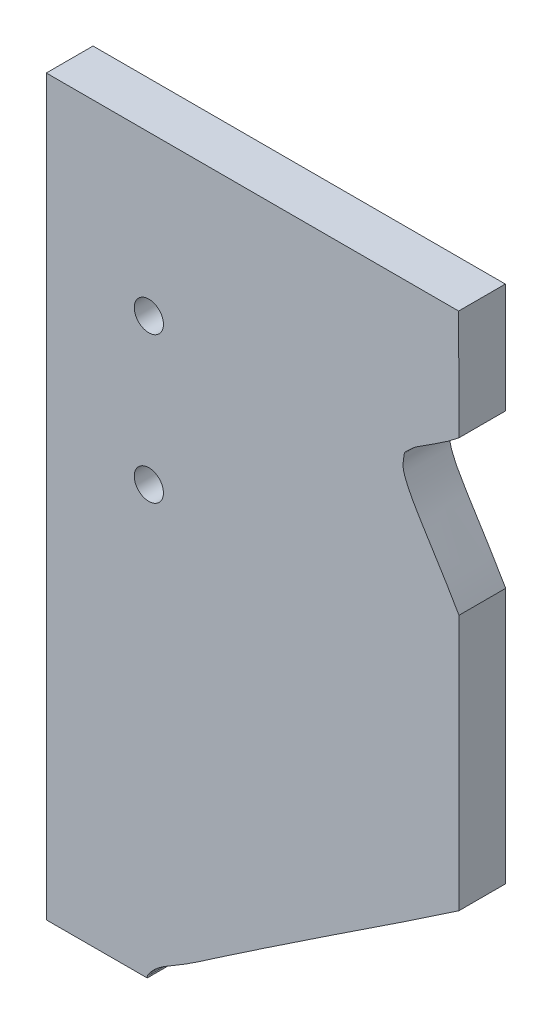
ISO-10303-21;
HEADER;
FILE_DESCRIPTION(('STEP AP214'),'2;1');
FILE_NAME('part.step','',(''),(''),'','','');
FILE_SCHEMA(('AUTOMOTIVE_DESIGN { 1 0 10303 214 1 1 1 1 }'));
ENDSEC;
DATA;
#1=APPLICATION_CONTEXT('core data for automotive mechanical design processes');
#2=APPLICATION_PROTOCOL_DEFINITION('international standard','automotive_design',2000,#1);
#3=PRODUCT_CONTEXT('',#1,'mechanical');
#4=PRODUCT('Part','Part','',(#3));
#5=PRODUCT_RELATED_PRODUCT_CATEGORY('part','',(#4));
#6=PRODUCT_DEFINITION_FORMATION('','',#4);
#7=PRODUCT_DEFINITION_CONTEXT('part definition',#1,'design');
#8=PRODUCT_DEFINITION('design','',#6,#7);
#9=PRODUCT_DEFINITION_SHAPE('','',#8);
#10=(LENGTH_UNIT() NAMED_UNIT(*) SI_UNIT(.MILLI.,.METRE.));
#11=(NAMED_UNIT(*) PLANE_ANGLE_UNIT() SI_UNIT($,.RADIAN.));
#12=(NAMED_UNIT(*) SI_UNIT($,.STERADIAN.) SOLID_ANGLE_UNIT());
#13=UNCERTAINTY_MEASURE_WITH_UNIT(LENGTH_MEASURE(1.E-05),#10,'distance_accuracy_value','');
#14=(GEOMETRIC_REPRESENTATION_CONTEXT(3) GLOBAL_UNCERTAINTY_ASSIGNED_CONTEXT((#13)) GLOBAL_UNIT_ASSIGNED_CONTEXT((#10,
#11,#12)) REPRESENTATION_CONTEXT('',''));
#15=CARTESIAN_POINT('',(0.,0.,0.));
#16=DIRECTION('',(0.,0.,1.));
#17=DIRECTION('',(1.,0.,0.));
#18=AXIS2_PLACEMENT_3D('',#15,#16,#17);
#19=CARTESIAN_POINT('',(-55.4502078162513,-28.5161604720001,59.9999999999997));
#20=DIRECTION('',(0.,0.,-1.));
#21=DIRECTION('',(-1.,0.,0.));
#22=AXIS2_PLACEMENT_3D('',#19,#20,#21);
#23=PLANE('',#22);
#24=CARTESIAN_POINT('',(-100.,-50.,59.9999999999997));
#25=DIRECTION('',(0.,0.,-1.));
#26=DIRECTION('',(-1.,0.,0.));
#27=AXIS2_PLACEMENT_3D('',#24,#25,#26);
#28=CIRCLE('',#27,2.5);
#29=CARTESIAN_POINT('',(-102.5,-50.,59.9999999999997));
#30=VERTEX_POINT('',#29);
#31=EDGE_CURVE('E193',#30,#30,#28,.F.);
#32=ORIENTED_EDGE('',*,*,#31,.T.);
#33=EDGE_LOOP('',(#32));
#34=FACE_BOUND('',#33,.T.);
#35=DIRECTION('',(-0.00329523929890578,0.999994570684243,0.));
#36=VECTOR('',#35,1.);
#37=CARTESIAN_POINT('',(-46.9522397554417,2.25600000000002,59.9999999999997));
#38=LINE('',#37,#36);
#39=CARTESIAN_POINT('',(-46.8903743110803,-16.5180867544561,59.9999999999997));
#40=VERTEX_POINT('',#39);
#41=CARTESIAN_POINT('',(-46.9522397554417,2.25600000000002,59.9999999999997));
#42=VERTEX_POINT('',#41);
#43=EDGE_CURVE('E208',#40,#42,#38,.T.);
#44=ORIENTED_EDGE('',*,*,#43,.F.);
#45=CARTESIAN_POINT('',(-46.8903743110803,-42.8368554623857,59.9999999999997));
#46=CARTESIAN_POINT('',(-47.577841512641,-41.627083206683,59.9999999999997));
#47=CARTESIAN_POINT('',(-48.2843458582711,-40.4287165550813,59.9999999999997));
#48=CARTESIAN_POINT('',(-49.7245958218818,-38.0483041436303,59.9999999999997));
#49=CARTESIAN_POINT('',(-50.4581048826457,-36.8661166567474,59.9999999999997));
#50=CARTESIAN_POINT('',(-51.9331435844763,-34.5065470026901,59.9999999999997));
#51=CARTESIAN_POINT('',(-52.6767856865731,-33.3300541308021,59.9999999999997));
#52=CARTESIAN_POINT('',(-53.7634208995857,-31.5494061512727,59.9999999999997));
#53=CARTESIAN_POINT('',(-54.1206803125053,-30.9532466378648,59.9999999999997));
#54=CARTESIAN_POINT('',(-54.8112962614617,-29.7483292902194,59.9999999999997));
#55=CARTESIAN_POINT('',(-55.1443499225886,-29.1394118218381,59.9999999999997));
#56=CARTESIAN_POINT('',(-55.6031367630828,-28.2045347970809,59.9999999999997));
#57=CARTESIAN_POINT('',(-55.7497021311432,-27.8895551155552,59.9999999999997));
#58=CARTESIAN_POINT('',(-56.0210788201949,-27.2481300002574,59.9999999999997));
#59=CARTESIAN_POINT('',(-56.1469820535764,-26.921105050299,59.9999999999997));
#60=CARTESIAN_POINT('',(-56.3540756083852,-26.2483713047994,59.9999999999997));
#61=CARTESIAN_POINT('',(-56.435641091222,-25.9087287667728,59.9999999999997));
#62=CARTESIAN_POINT('',(-56.4738238150031,-25.3867225679931,59.9999999999997));
#63=CARTESIAN_POINT('',(-56.471737301867,-25.2098957953886,59.9999999999997));
#64=CARTESIAN_POINT('',(-56.4419620026412,-24.8551534569222,59.9999999999997));
#65=CARTESIAN_POINT('',(-56.4148157364366,-24.6792915836289,59.9999999999997));
#66=CARTESIAN_POINT('',(-56.3615164570491,-24.3274455465097,59.9999999999997));
#67=CARTESIAN_POINT('',(-56.3403849661277,-24.1508431266917,59.9999999999997));
#68=CARTESIAN_POINT('',(-56.3119929322862,-23.8855325563661,59.9999999999997));
#69=CARTESIAN_POINT('',(-56.3032708730401,-23.7968422560632,59.9999999999997));
#70=CARTESIAN_POINT('',(-56.2773210561154,-23.6213801901492,59.9999999999997));
#71=CARTESIAN_POINT('',(-56.2596038198692,-23.534792068782,59.9999999999997));
#72=CARTESIAN_POINT('',(-56.1945516368907,-23.3687537604382,59.9999999999997));
#73=CARTESIAN_POINT('',(-56.1462941516276,-23.292664428043,59.9999999999997));
#74=CARTESIAN_POINT('',(-56.0365244294935,-23.1542073276442,59.9999999999997));
#75=CARTESIAN_POINT('',(-55.9741911317521,-23.0902627553877,59.9999999999997));
#76=CARTESIAN_POINT('',(-55.7839779795194,-22.9027968437123,59.9999999999997));
#77=CARTESIAN_POINT('',(-55.653200144675,-22.7820392301401,59.9999999999997));
#78=CARTESIAN_POINT('',(-55.2651250921947,-22.4152390723146,59.9999999999997));
#79=CARTESIAN_POINT('',(-55.0084049922605,-22.167768422196,59.9999999999997));
#80=CARTESIAN_POINT('',(-54.6029691585302,-21.8209258688201,59.9999999999997));
#81=CARTESIAN_POINT('',(-54.4651527317852,-21.7092140300811,59.9999999999997));
#82=CARTESIAN_POINT('',(-54.1824003209873,-21.4961914854881,59.9999999999997));
#83=CARTESIAN_POINT('',(-54.0377792655573,-21.3944206928177,59.9999999999997));
#84=CARTESIAN_POINT('',(-53.5985742670205,-21.096912326298,59.9999999999997));
#85=CARTESIAN_POINT('',(-53.2990921568336,-20.9083306028042,59.9999999999997));
#86=CARTESIAN_POINT('',(-52.6995175466854,-20.5320588889512,59.9999999999997));
#87=CARTESIAN_POINT('',(-52.3987660163854,-20.3453134802837,59.9999999999997));
#88=CARTESIAN_POINT('',(-51.4992462435876,-19.7812090977366,59.9999999999997));
#89=CARTESIAN_POINT('',(-50.9020306229045,-19.4018127967956,59.9999999999997));
#90=CARTESIAN_POINT('',(-49.1315614734809,-18.2350339391271,59.9999999999997));
#91=CARTESIAN_POINT('',(-47.97511218539,-17.4249656235601,59.9999999999997));
#92=CARTESIAN_POINT('',(-46.8903743110803,-16.5180867544561,59.9999999999997));
#93=B_SPLINE_CURVE_WITH_KNOTS('',3,(#45,#46,#47,#48,#49,#50,#51,#52,#53,#54,#55,#56,#57,#58,#59,
#60,#61,#62,#63,#64,#65,#66,#67,#68,#69,#70,#71,#72,#73,#74,#75,#76,#77,#78,#79,#80,#81,#82,#83,
#84,#85,#86,#87,#88,#89,#90,#91,#92),.UNSPECIFIED.,.F.,.F.,(4,2,2,2,2,2,2,2,2,2,2,2,2,2,2,2,2,2,
2,2,2,2,2,4),(0.,0.125000000000001,0.250000000000002,0.375000000000004,0.437500000000004,
0.500000000000004,0.531250000000005,0.562500000000005,0.593750000000005,0.609375000000005,
0.625000000000005,0.640625000000005,0.648437500000005,0.656250000000005,0.664062500000005,
0.671875000000005,0.687500000000004,0.718750000000004,0.734375000000004,0.750000000000003,
0.781250000000003,0.812500000000003,0.875000000000002,1.),.UNSPECIFIED.);
#94=CARTESIAN_POINT('',(-46.8903743110803,-42.8368554623857,59.9999999999997));
#95=VERTEX_POINT('',#94);
#96=EDGE_CURVE('E114',#95,#40,#93,.T.);
#97=ORIENTED_EDGE('',*,*,#96,.F.);
#98=DIRECTION('',(3.6583001462466E-13,1.,0.));
#99=VECTOR('',#98,1.);
#100=CARTESIAN_POINT('',(-46.8903743110964,-86.6518631906914,59.9999999999997));
#101=LINE('',#100,#99);
#102=CARTESIAN_POINT('',(-46.8903743110964,-86.6518631906914,59.9999999999997));
#103=VERTEX_POINT('',#102);
#104=EDGE_CURVE('E98',#103,#95,#101,.T.);
#105=ORIENTED_EDGE('',*,*,#104,.F.);
#106=CARTESIAN_POINT('',(-100.275103398286,-123.322008270188,59.9999999999997));
#107=CARTESIAN_POINT('',(-100.292670086829,-123.237659442665,59.9999999999997));
#108=CARTESIAN_POINT('',(-100.286943133707,-123.149597670493,59.9999999999997));
#109=CARTESIAN_POINT('',(-100.24673830505,-122.983267523636,59.9999999999997));
#110=CARTESIAN_POINT('',(-100.21321401355,-122.904024054248,59.9999999999997));
#111=CARTESIAN_POINT('',(-100.095778030498,-122.675443040684,59.9999999999997));
#112=CARTESIAN_POINT('',(-99.9987581683569,-122.536378550736,59.9999999999997));
#113=CARTESIAN_POINT('',(-99.6918557117414,-122.130454763805,59.9999999999997));
#114=CARTESIAN_POINT('',(-99.4658154430958,-121.874230818477,59.9999999999997));
#115=CARTESIAN_POINT('',(-98.9920855294368,-121.393753292081,59.9999999999997));
#116=CARTESIAN_POINT('',(-98.7429585858308,-121.168134946171,59.9999999999997));
#117=CARTESIAN_POINT('',(-98.2197841384774,-120.746611953683,59.9999999999997));
#118=CARTESIAN_POINT('',(-97.946951942382,-120.549258251146,59.9999999999997));
#119=CARTESIAN_POINT('',(-97.1079343080353,-119.981665140612,59.9999999999997));
#120=CARTESIAN_POINT('',(-96.5240230742452,-119.636060657458,59.9999999999997));
#121=CARTESIAN_POINT('',(-95.355451368251,-118.952340305748,59.9999999999997));
#122=CARTESIAN_POINT('',(-94.7690206274353,-118.613997741784,59.9999999999997));
#123=CARTESIAN_POINT('',(-93.608972393396,-117.916298912487,59.9999999999997));
#124=CARTESIAN_POINT('',(-93.035913951721,-117.556025803691,59.9999999999997));
#125=CARTESIAN_POINT('',(-91.9053306979873,-116.81000446345,59.9999999999997));
#126=CARTESIAN_POINT('',(-91.3471809653472,-116.426143203313,59.9999999999997));
#127=CARTESIAN_POINT('',(-90.2326719214501,-115.656151760782,59.9999999999997));
#128=CARTESIAN_POINT('',(-89.6749740238099,-115.27180583894,59.9999999999997));
#129=CARTESIAN_POINT('',(-88.5557002273108,-114.508797488965,59.9999999999997));
#130=CARTESIAN_POINT('',(-87.995001450867,-114.128849351228,59.9999999999997));
#131=CARTESIAN_POINT('',(-86.31149755831,-112.99106917423,59.9999999999997));
#132=CARTESIAN_POINT('',(-85.1871333542925,-112.235554511051,59.9999999999997));
#133=CARTESIAN_POINT('',(-82.9418160254921,-110.719470721535,59.9999999999997));
#134=CARTESIAN_POINT('',(-81.8204542325397,-109.95950727295,59.9999999999997));
#135=CARTESIAN_POINT('',(-78.4543102970864,-107.682666655866,59.9999999999997));
#136=CARTESIAN_POINT('',(-76.2039706974002,-106.17401304781,59.9999999999997));
#137=CARTESIAN_POINT('',(-69.4381040286957,-101.670370528875,59.9999999999997));
#138=CARTESIAN_POINT('',(-64.9116344723817,-98.6918694402045,59.9999999999997));
#139=CARTESIAN_POINT('',(-55.8713698781167,-92.715939032799,59.9999999999997));
#140=CARTESIAN_POINT('',(-51.3593789046934,-89.7158659786598,59.9999999999997));
#141=CARTESIAN_POINT('',(-46.8903743110964,-86.6518631906914,59.9999999999997));
#142=B_SPLINE_CURVE_WITH_KNOTS('',3,(#106,#107,#108,#109,#110,#111,#112,#113,#114,#115,#116,
#117,#118,#119,#120,#121,#122,#123,#124,#125,#126,#127,#128,#129,#130,#131,#132,#133,#134,#135,
#136,#137,#138,#139,#140,#141),.UNSPECIFIED.,.F.,.F.,(4,2,2,2,2,2,2,2,2,2,2,2,2,2,2,2,2,4),(0.,
0.00390625000000024,0.00781250000000048,0.0156250000000001,0.0312500000000002,
0.0468750000000004,0.0625000000000005,0.0937500000000007,0.125000000000001,0.156250000000001,
0.187500000000001,0.218750000000001,0.250000000000001,0.312500000000001,0.375000000000001,
0.500000000000001,0.75,1.),.UNSPECIFIED.);
#143=CARTESIAN_POINT('',(-100.275103398296,-123.322008270193,59.9999999999997));
#144=VERTEX_POINT('',#143);
#145=EDGE_CURVE('E111',#144,#103,#142,.T.);
#146=ORIENTED_EDGE('',*,*,#145,.F.);
#147=CARTESIAN_POINT('',(-117.559064958847,-123.347174237354,59.9999999999997));
#148=CARTESIAN_POINT('',(-111.797743718841,-123.339295449862,59.9999999999997));
#149=CARTESIAN_POINT('',(-106.036423042849,-123.330978170788,59.9999999999997));
#150=CARTESIAN_POINT('',(-100.275103398296,-123.322008270193,59.9999999999997));
#151=B_SPLINE_CURVE_WITH_KNOTS('',3,(#147,#148,#149,#150),.UNSPECIFIED.,.F.,.F.,(4,4),(0.,1.),.UNSPECIFIED.);
#152=CARTESIAN_POINT('',(-117.559064958847,-123.347174237354,59.9999999999997));
#153=VERTEX_POINT('',#152);
#154=EDGE_CURVE('E119',#153,#144,#151,.T.);
#155=ORIENTED_EDGE('',*,*,#154,.F.);
#156=DIRECTION('',(2.02932824030015E-06,-0.999999999997941,0.));
#157=VECTOR('',#156,1.);
#158=CARTESIAN_POINT('',(-117.559319848916,2.25600000000001,59.9999999999997));
#159=LINE('',#158,#157);
#160=CARTESIAN_POINT('',(-117.559319848916,2.25600000000001,59.9999999999997));
#161=VERTEX_POINT('',#160);
#162=EDGE_CURVE('E207',#161,#153,#159,.T.);
#163=ORIENTED_EDGE('',*,*,#162,.F.);
#164=DIRECTION('',(-1.,0.,0.));
#165=VECTOR('',#164,1.);
#166=CARTESIAN_POINT('',(-46.9522397554417,2.25600000000002,59.9999999999997));
#167=LINE('',#166,#165);
#168=EDGE_CURVE('E206',#42,#161,#167,.T.);
#169=ORIENTED_EDGE('',*,*,#168,.F.);
#170=EDGE_LOOP('',(#44,#97,#105,#146,#155,#163,#169));
#171=FACE_BOUND('',#170,.T.);
#172=CARTESIAN_POINT('',(-100.,-25.,59.9999999999997));
#173=DIRECTION('',(0.,0.,-1.));
#174=DIRECTION('',(-1.,0.,0.));
#175=AXIS2_PLACEMENT_3D('',#172,#173,#174);
#176=CIRCLE('',#175,2.5);
#177=CARTESIAN_POINT('',(-102.5,-25.,59.9999999999997));
#178=VERTEX_POINT('',#177);
#179=EDGE_CURVE('E204',#178,#178,#176,.F.);
#180=ORIENTED_EDGE('',*,*,#179,.T.);
#181=EDGE_LOOP('',(#180));
#182=FACE_BOUND('',#181,.T.);
#183=ADVANCED_FACE('F30',(#34,#171,#182),#23,.T.);
#184=CARTESIAN_POINT('',(-55.4502078162513,-28.5161604720001,67.9999999999997));
#185=DIRECTION('',(0.,0.,-1.));
#186=DIRECTION('',(-1.,0.,0.));
#187=AXIS2_PLACEMENT_3D('',#184,#185,#186);
#188=PLANE('',#187);
#189=CARTESIAN_POINT('',(-100.,-50.,67.9999999999997));
#190=DIRECTION('',(0.,0.,-1.));
#191=DIRECTION('',(-1.,0.,0.));
#192=AXIS2_PLACEMENT_3D('',#189,#190,#191);
#193=CIRCLE('',#192,2.5);
#194=CARTESIAN_POINT('',(-102.5,-50.,67.9999999999997));
#195=VERTEX_POINT('',#194);
#196=EDGE_CURVE('E199',#195,#195,#193,.F.);
#197=ORIENTED_EDGE('',*,*,#196,.F.);
#198=EDGE_LOOP('',(#197));
#199=FACE_BOUND('',#198,.T.);
#200=DIRECTION('',(-0.00329523929890578,0.999994570684243,0.));
#201=VECTOR('',#200,1.);
#202=CARTESIAN_POINT('',(-46.9522397554417,2.25600000000002,67.9999999999997));
#203=LINE('',#202,#201);
#204=CARTESIAN_POINT('',(-46.8903743110803,-16.5180867544561,67.9999999999997));
#205=VERTEX_POINT('',#204);
#206=CARTESIAN_POINT('',(-46.9522397554417,2.25600000000002,67.9999999999997));
#207=VERTEX_POINT('',#206);
#208=EDGE_CURVE('E191',#205,#207,#203,.T.);
#209=ORIENTED_EDGE('',*,*,#208,.T.);
#210=DIRECTION('',(-1.,0.,0.));
#211=VECTOR('',#210,1.);
#212=CARTESIAN_POINT('',(-46.9522397554417,2.25600000000002,67.9999999999997));
#213=LINE('',#212,#211);
#214=CARTESIAN_POINT('',(-117.559319848916,2.25600000000001,67.9999999999997));
#215=VERTEX_POINT('',#214);
#216=EDGE_CURVE('E159',#207,#215,#213,.T.);
#217=ORIENTED_EDGE('',*,*,#216,.T.);
#218=DIRECTION('',(2.02932824030015E-06,-0.999999999997941,0.));
#219=VECTOR('',#218,1.);
#220=CARTESIAN_POINT('',(-117.559319848916,2.25600000000001,67.9999999999997));
#221=LINE('',#220,#219);
#222=CARTESIAN_POINT('',(-117.559064958847,-123.347174237354,67.9999999999997));
#223=VERTEX_POINT('',#222);
#224=EDGE_CURVE('E197',#215,#223,#221,.T.);
#225=ORIENTED_EDGE('',*,*,#224,.T.);
#226=CARTESIAN_POINT('',(-100.275103398296,-123.322008270193,67.9999999999997));
#227=CARTESIAN_POINT('',(-106.036423042849,-123.330978170788,67.9999999999997));
#228=CARTESIAN_POINT('',(-111.797743718841,-123.339295449862,67.9999999999997));
#229=CARTESIAN_POINT('',(-117.559064958847,-123.347174237354,67.9999999999997));
#230=B_SPLINE_CURVE_WITH_KNOTS('',3,(#226,#227,#228,#229),.UNSPECIFIED.,.F.,.F.,(4,4),(0.,1.),.UNSPECIFIED.);
#231=CARTESIAN_POINT('',(-100.275103398296,-123.322008270193,67.9999999999997));
#232=VERTEX_POINT('',#231);
#233=EDGE_CURVE('E307',#223,#232,#230,.F.);
#234=ORIENTED_EDGE('',*,*,#233,.T.);
#235=CARTESIAN_POINT('',(-46.8903743110964,-86.6518631906914,67.9999999999997));
#236=CARTESIAN_POINT('',(-51.3593789046934,-89.7158659786598,67.9999999999997));
#237=CARTESIAN_POINT('',(-55.8713698781167,-92.715939032799,67.9999999999997));
#238=CARTESIAN_POINT('',(-64.9116344723817,-98.6918694402045,67.9999999999997));
#239=CARTESIAN_POINT('',(-69.4381040286957,-101.670370528875,67.9999999999997));
#240=CARTESIAN_POINT('',(-76.2039706974002,-106.17401304781,67.9999999999997));
#241=CARTESIAN_POINT('',(-78.4543102970864,-107.682666655866,67.9999999999997));
#242=CARTESIAN_POINT('',(-81.8204542325397,-109.95950727295,67.9999999999997));
#243=CARTESIAN_POINT('',(-82.9418160254921,-110.719470721535,67.9999999999997));
#244=CARTESIAN_POINT('',(-85.1871333542925,-112.235554511051,67.9999999999997));
#245=CARTESIAN_POINT('',(-86.31149755831,-112.99106917423,67.9999999999997));
#246=CARTESIAN_POINT('',(-87.995001450867,-114.128849351228,67.9999999999997));
#247=CARTESIAN_POINT('',(-88.5557002273108,-114.508797488965,67.9999999999997));
#248=CARTESIAN_POINT('',(-89.6749740238099,-115.27180583894,67.9999999999997));
#249=CARTESIAN_POINT('',(-90.2326719214501,-115.656151760782,67.9999999999997));
#250=CARTESIAN_POINT('',(-91.3471809653472,-116.426143203313,67.9999999999997));
#251=CARTESIAN_POINT('',(-91.9053306979873,-116.81000446345,67.9999999999997));
#252=CARTESIAN_POINT('',(-93.035913951721,-117.556025803691,67.9999999999997));
#253=CARTESIAN_POINT('',(-93.608972393396,-117.916298912487,67.9999999999997));
#254=CARTESIAN_POINT('',(-94.7690206274353,-118.613997741784,67.9999999999997));
#255=CARTESIAN_POINT('',(-95.355451368251,-118.952340305748,67.9999999999997));
#256=CARTESIAN_POINT('',(-96.5240230742452,-119.636060657458,67.9999999999997));
#257=CARTESIAN_POINT('',(-97.1079343080353,-119.981665140612,67.9999999999997));
#258=CARTESIAN_POINT('',(-97.946951942382,-120.549258251146,67.9999999999997));
#259=CARTESIAN_POINT('',(-98.2197841384774,-120.746611953683,67.9999999999997));
#260=CARTESIAN_POINT('',(-98.7429585858308,-121.168134946171,67.9999999999997));
#261=CARTESIAN_POINT('',(-98.9920855294368,-121.393753292081,67.9999999999997));
#262=CARTESIAN_POINT('',(-99.4658154430958,-121.874230818477,67.9999999999997));
#263=CARTESIAN_POINT('',(-99.6918557117414,-122.130454763805,67.9999999999997));
#264=CARTESIAN_POINT('',(-99.9987581683569,-122.536378550736,67.9999999999997));
#265=CARTESIAN_POINT('',(-100.095778030498,-122.675443040684,67.9999999999997));
#266=CARTESIAN_POINT('',(-100.21321401355,-122.904024054248,67.9999999999997));
#267=CARTESIAN_POINT('',(-100.24673830505,-122.983267523636,67.9999999999997));
#268=CARTESIAN_POINT('',(-100.286943133707,-123.149597670493,67.9999999999997));
#269=CARTESIAN_POINT('',(-100.292670086829,-123.237659442665,67.9999999999997));
#270=CARTESIAN_POINT('',(-100.275103398286,-123.322008270188,67.9999999999997));
#271=B_SPLINE_CURVE_WITH_KNOTS('',3,(#235,#236,#237,#238,#239,#240,#241,#242,#243,#244,#245,
#246,#247,#248,#249,#250,#251,#252,#253,#254,#255,#256,#257,#258,#259,#260,#261,#262,#263,#264,
#265,#266,#267,#268,#269,#270),.UNSPECIFIED.,.F.,.F.,(4,2,2,2,2,2,2,2,2,2,2,2,2,2,2,2,2,4),(0.,
0.25,0.499999999999999,0.624999999999999,0.687499999999999,0.749999999999999,0.781249999999999,
0.812499999999999,0.843749999999999,0.874999999999999,0.906249999999999,0.937499999999999,
0.953125,0.96875,0.984375,0.9921875,0.99609375,1.),.UNSPECIFIED.);
#272=CARTESIAN_POINT('',(-46.8903743110964,-86.6518631906914,67.9999999999997));
#273=VERTEX_POINT('',#272);
#274=EDGE_CURVE('E189',#232,#273,#271,.F.);
#275=ORIENTED_EDGE('',*,*,#274,.T.);
#276=DIRECTION('',(3.6583001462466E-13,1.,0.));
#277=VECTOR('',#276,1.);
#278=CARTESIAN_POINT('',(-46.8903743110964,-86.6518631906914,67.9999999999997));
#279=LINE('',#278,#277);
#280=CARTESIAN_POINT('',(-46.8903743110803,-42.8368554623857,67.9999999999997));
#281=VERTEX_POINT('',#280);
#282=EDGE_CURVE('E100',#273,#281,#279,.T.);
#283=ORIENTED_EDGE('',*,*,#282,.T.);
#284=CARTESIAN_POINT('',(-46.8903743110803,-16.5180867544561,67.9999999999996));
#285=CARTESIAN_POINT('',(-47.97511218539,-17.4249656235601,67.9999999999996));
#286=CARTESIAN_POINT('',(-49.1315614734809,-18.2350339391271,67.9999999999996));
#287=CARTESIAN_POINT('',(-50.9020306229045,-19.4018127967956,67.9999999999996));
#288=CARTESIAN_POINT('',(-51.4992462435876,-19.7812090977366,67.9999999999996));
#289=CARTESIAN_POINT('',(-52.3987660163854,-20.3453134802837,67.9999999999996));
#290=CARTESIAN_POINT('',(-52.6995175466854,-20.5320588889512,67.9999999999996));
#291=CARTESIAN_POINT('',(-53.2990921568336,-20.9083306028042,67.9999999999996));
#292=CARTESIAN_POINT('',(-53.5985742670205,-21.096912326298,67.9999999999996));
#293=CARTESIAN_POINT('',(-54.0377792655573,-21.3944206928177,67.9999999999996));
#294=CARTESIAN_POINT('',(-54.1824003209873,-21.4961914854881,67.9999999999996));
#295=CARTESIAN_POINT('',(-54.4651527317852,-21.7092140300811,67.9999999999996));
#296=CARTESIAN_POINT('',(-54.6029691585302,-21.8209258688201,67.9999999999996));
#297=CARTESIAN_POINT('',(-55.0084049922605,-22.167768422196,67.9999999999996));
#298=CARTESIAN_POINT('',(-55.2651250921947,-22.4152390723146,67.9999999999996));
#299=CARTESIAN_POINT('',(-55.653200144675,-22.7820392301401,67.9999999999996));
#300=CARTESIAN_POINT('',(-55.7839779795194,-22.9027968437123,67.9999999999996));
#301=CARTESIAN_POINT('',(-55.9741911317521,-23.0902627553877,67.9999999999996));
#302=CARTESIAN_POINT('',(-56.0365244294935,-23.1542073276442,67.9999999999996));
#303=CARTESIAN_POINT('',(-56.1462941516276,-23.292664428043,67.9999999999996));
#304=CARTESIAN_POINT('',(-56.1945516368907,-23.3687537604382,67.9999999999996));
#305=CARTESIAN_POINT('',(-56.2596038198692,-23.534792068782,67.9999999999996));
#306=CARTESIAN_POINT('',(-56.2773210561154,-23.6213801901492,67.9999999999996));
#307=CARTESIAN_POINT('',(-56.3032708730401,-23.7968422560632,67.9999999999996));
#308=CARTESIAN_POINT('',(-56.3119929322862,-23.8855325563661,67.9999999999996));
#309=CARTESIAN_POINT('',(-56.3403849661277,-24.1508431266917,67.9999999999996));
#310=CARTESIAN_POINT('',(-56.3615164570491,-24.3274455465097,67.9999999999996));
#311=CARTESIAN_POINT('',(-56.4148157364366,-24.6792915836289,67.9999999999996));
#312=CARTESIAN_POINT('',(-56.4419620026412,-24.8551534569222,67.9999999999996));
#313=CARTESIAN_POINT('',(-56.471737301867,-25.2098957953886,67.9999999999996));
#314=CARTESIAN_POINT('',(-56.4738238150031,-25.3867225679931,67.9999999999996));
#315=CARTESIAN_POINT('',(-56.435641091222,-25.9087287667728,67.9999999999996));
#316=CARTESIAN_POINT('',(-56.3540756083852,-26.2483713047994,67.9999999999996));
#317=CARTESIAN_POINT('',(-56.1469820535764,-26.921105050299,67.9999999999996));
#318=CARTESIAN_POINT('',(-56.0210788201949,-27.2481300002574,67.9999999999996));
#319=CARTESIAN_POINT('',(-55.7497021311432,-27.8895551155552,67.9999999999996));
#320=CARTESIAN_POINT('',(-55.6031367630828,-28.2045347970809,67.9999999999996));
#321=CARTESIAN_POINT('',(-55.1443499225886,-29.1394118218381,67.9999999999996));
#322=CARTESIAN_POINT('',(-54.8112962614617,-29.7483292902194,67.9999999999996));
#323=CARTESIAN_POINT('',(-54.1206803125053,-30.9532466378648,67.9999999999996));
#324=CARTESIAN_POINT('',(-53.7634208995857,-31.5494061512727,67.9999999999996));
#325=CARTESIAN_POINT('',(-52.6767856865731,-33.3300541308021,67.9999999999996));
#326=CARTESIAN_POINT('',(-51.9331435844763,-34.5065470026901,67.9999999999996));
#327=CARTESIAN_POINT('',(-50.4581048826457,-36.8661166567474,67.9999999999996));
#328=CARTESIAN_POINT('',(-49.7245958218818,-38.0483041436303,67.9999999999996));
#329=CARTESIAN_POINT('',(-48.2843458582711,-40.4287165550813,67.9999999999996));
#330=CARTESIAN_POINT('',(-47.577841512641,-41.627083206683,67.9999999999996));
#331=CARTESIAN_POINT('',(-46.8903743110803,-42.8368554623857,67.9999999999996));
#332=B_SPLINE_CURVE_WITH_KNOTS('',3,(#284,#285,#286,#287,#288,#289,#290,#291,#292,#293,#294,
#295,#296,#297,#298,#299,#300,#301,#302,#303,#304,#305,#306,#307,#308,#309,#310,#311,#312,#313,
#314,#315,#316,#317,#318,#319,#320,#321,#322,#323,#324,#325,#326,#327,#328,#329,#330,#331),
.UNSPECIFIED.,.F.,.F.,(4,2,2,2,2,2,2,2,2,2,2,2,2,2,2,2,2,2,2,2,2,2,2,4),(0.,0.124999999999998,
0.187499999999997,0.218749999999997,0.249999999999997,0.265624999999996,0.281249999999996,
0.312499999999996,0.328124999999995,0.335937499999995,0.343749999999995,0.351562499999995,
0.359374999999995,0.374999999999995,0.390624999999995,0.406249999999995,0.437499999999995,
0.468749999999995,0.499999999999996,0.562499999999996,0.624999999999996,0.749999999999998,
0.874999999999999,1.),.UNSPECIFIED.);
#333=EDGE_CURVE('E188',#281,#205,#332,.F.);
#334=ORIENTED_EDGE('',*,*,#333,.T.);
#335=EDGE_LOOP('',(#209,#217,#225,#234,#275,#283,#334));
#336=FACE_BOUND('',#335,.T.);
#337=CARTESIAN_POINT('',(-100.,-25.,67.9999999999997));
#338=DIRECTION('',(0.,0.,-1.));
#339=DIRECTION('',(-1.,0.,0.));
#340=AXIS2_PLACEMENT_3D('',#337,#338,#339);
#341=CIRCLE('',#340,2.5);
#342=CARTESIAN_POINT('',(-102.5,-25.,67.9999999999997));
#343=VERTEX_POINT('',#342);
#344=EDGE_CURVE('E34',#343,#343,#341,.F.);
#345=ORIENTED_EDGE('',*,*,#344,.F.);
#346=EDGE_LOOP('',(#345));
#347=FACE_BOUND('',#346,.T.);
#348=ADVANCED_FACE('F168',(#199,#336,#347),#188,.F.);
#349=CARTESIAN_POINT('',(-46.9522397554417,2.25600000000002,59.9999999999997));
#350=DIRECTION('',(0.999994570684243,0.00329523929890578,0.));
#351=DIRECTION('',(-0.00329523929890578,0.999994570684243,0.));
#352=AXIS2_PLACEMENT_3D('',#349,#350,#351);
#353=PLANE('',#352);
#354=ORIENTED_EDGE('',*,*,#208,.F.);
#355=DIRECTION('',(0.,0.,1.));
#356=VECTOR('',#355,1.);
#357=CARTESIAN_POINT('',(-46.8903743110803,-16.5180867544561,59.9999999999997));
#358=LINE('',#357,#356);
#359=EDGE_CURVE('E11',#40,#205,#358,.T.);
#360=ORIENTED_EDGE('',*,*,#359,.F.);
#361=ORIENTED_EDGE('',*,*,#43,.T.);
#362=DIRECTION('',(0.,0.,1.));
#363=VECTOR('',#362,1.);
#364=CARTESIAN_POINT('',(-46.9522397554417,2.25600000000002,59.9999999999997));
#365=LINE('',#364,#363);
#366=EDGE_CURVE('E84',#42,#207,#365,.T.);
#367=ORIENTED_EDGE('',*,*,#366,.T.);
#368=EDGE_LOOP('',(#354,#360,#361,#367));
#369=FACE_BOUND('',#368,.T.);
#370=ADVANCED_FACE('F32',(#369),#353,.T.);
#371=CARTESIAN_POINT('',(-46.8903743110803,-42.8368554623857,59.9999999999997));
#372=CARTESIAN_POINT('',(-47.577841512641,-41.627083206683,59.9999999999997));
#373=CARTESIAN_POINT('',(-48.2843458582711,-40.4287165550813,59.9999999999997));
#374=CARTESIAN_POINT('',(-49.7245958218818,-38.0483041436303,59.9999999999997));
#375=CARTESIAN_POINT('',(-50.4581048826457,-36.8661166567474,59.9999999999997));
#376=CARTESIAN_POINT('',(-51.9331435844763,-34.5065470026901,59.9999999999997));
#377=CARTESIAN_POINT('',(-52.6767856865731,-33.3300541308021,59.9999999999997));
#378=CARTESIAN_POINT('',(-53.7634208995857,-31.5494061512727,59.9999999999997));
#379=CARTESIAN_POINT('',(-54.1206803125053,-30.9532466378648,59.9999999999997));
#380=CARTESIAN_POINT('',(-54.8112962614617,-29.7483292902194,59.9999999999997));
#381=CARTESIAN_POINT('',(-55.1443499225886,-29.1394118218381,59.9999999999997));
#382=CARTESIAN_POINT('',(-55.6031367630828,-28.2045347970809,59.9999999999997));
#383=CARTESIAN_POINT('',(-55.7497021311432,-27.8895551155552,59.9999999999997));
#384=CARTESIAN_POINT('',(-56.0210788201949,-27.2481300002574,59.9999999999997));
#385=CARTESIAN_POINT('',(-56.1469820535764,-26.921105050299,59.9999999999997));
#386=CARTESIAN_POINT('',(-56.3540756083852,-26.2483713047994,59.9999999999997));
#387=CARTESIAN_POINT('',(-56.435641091222,-25.9087287667728,59.9999999999997));
#388=CARTESIAN_POINT('',(-56.4738238150031,-25.3867225679931,59.9999999999997));
#389=CARTESIAN_POINT('',(-56.471737301867,-25.2098957953886,59.9999999999997));
#390=CARTESIAN_POINT('',(-56.4419620026412,-24.8551534569222,59.9999999999997));
#391=CARTESIAN_POINT('',(-56.4148157364366,-24.6792915836289,59.9999999999997));
#392=CARTESIAN_POINT('',(-56.3615164570491,-24.3274455465097,59.9999999999997));
#393=CARTESIAN_POINT('',(-56.3403849661277,-24.1508431266917,59.9999999999997));
#394=CARTESIAN_POINT('',(-56.3119929322862,-23.8855325563661,59.9999999999997));
#395=CARTESIAN_POINT('',(-56.3032708730401,-23.7968422560632,59.9999999999997));
#396=CARTESIAN_POINT('',(-56.2773210561154,-23.6213801901492,59.9999999999997));
#397=CARTESIAN_POINT('',(-56.2596038198692,-23.534792068782,59.9999999999997));
#398=CARTESIAN_POINT('',(-56.1945516368907,-23.3687537604382,59.9999999999997));
#399=CARTESIAN_POINT('',(-56.1462941516276,-23.292664428043,59.9999999999997));
#400=CARTESIAN_POINT('',(-56.0365244294935,-23.1542073276442,59.9999999999997));
#401=CARTESIAN_POINT('',(-55.9741911317521,-23.0902627553877,59.9999999999997));
#402=CARTESIAN_POINT('',(-55.7839779795194,-22.9027968437123,59.9999999999997));
#403=CARTESIAN_POINT('',(-55.653200144675,-22.7820392301401,59.9999999999997));
#404=CARTESIAN_POINT('',(-55.2651250921947,-22.4152390723146,59.9999999999997));
#405=CARTESIAN_POINT('',(-55.0084049922605,-22.167768422196,59.9999999999997));
#406=CARTESIAN_POINT('',(-54.6029691585302,-21.8209258688201,59.9999999999997));
#407=CARTESIAN_POINT('',(-54.4651527317852,-21.7092140300811,59.9999999999997));
#408=CARTESIAN_POINT('',(-54.1824003209873,-21.4961914854881,59.9999999999997));
#409=CARTESIAN_POINT('',(-54.0377792655573,-21.3944206928177,59.9999999999997));
#410=CARTESIAN_POINT('',(-53.5985742670205,-21.096912326298,59.9999999999997));
#411=CARTESIAN_POINT('',(-53.2990921568336,-20.9083306028042,59.9999999999997));
#412=CARTESIAN_POINT('',(-52.6995175466854,-20.5320588889512,59.9999999999997));
#413=CARTESIAN_POINT('',(-52.3987660163854,-20.3453134802837,59.9999999999997));
#414=CARTESIAN_POINT('',(-51.4992462435876,-19.7812090977366,59.9999999999997));
#415=CARTESIAN_POINT('',(-50.9020306229045,-19.4018127967956,59.9999999999997));
#416=CARTESIAN_POINT('',(-49.1315614734809,-18.2350339391271,59.9999999999997));
#417=CARTESIAN_POINT('',(-47.97511218539,-17.4249656235601,59.9999999999997));
#418=CARTESIAN_POINT('',(-46.8903743110803,-16.5180867544561,59.9999999999997));
#419=B_SPLINE_CURVE_WITH_KNOTS('',3,(#371,#372,#373,#374,#375,#376,#377,#378,#379,#380,#381,
#382,#383,#384,#385,#386,#387,#388,#389,#390,#391,#392,#393,#394,#395,#396,#397,#398,#399,#400,
#401,#402,#403,#404,#405,#406,#407,#408,#409,#410,#411,#412,#413,#414,#415,#416,#417,#418),
.UNSPECIFIED.,.F.,.F.,(4,2,2,2,2,2,2,2,2,2,2,2,2,2,2,2,2,2,2,2,2,2,2,4),(0.,0.125000000000001,
0.250000000000002,0.375000000000004,0.437500000000004,0.500000000000004,0.531250000000005,
0.562500000000005,0.593750000000005,0.609375000000005,0.625000000000005,0.640625000000005,
0.648437500000005,0.656250000000005,0.664062500000005,0.671875000000005,0.687500000000004,
0.718750000000004,0.734375000000004,0.750000000000003,0.781250000000003,0.812500000000003,
0.875000000000002,1.),.UNSPECIFIED.);
#420=DIRECTION('',(0.,0.,1.));
#421=VECTOR('',#420,1.);
#422=SURFACE_OF_LINEAR_EXTRUSION('',#419,#421);
#423=ORIENTED_EDGE('',*,*,#333,.F.);
#424=DIRECTION('',(0.,0.,1.));
#425=VECTOR('',#424,1.);
#426=CARTESIAN_POINT('',(-46.8903743110803,-42.8368554623857,59.9999999999997));
#427=LINE('',#426,#425);
#428=EDGE_CURVE('E40',#95,#281,#427,.T.);
#429=ORIENTED_EDGE('',*,*,#428,.F.);
#430=ORIENTED_EDGE('',*,*,#96,.T.);
#431=ORIENTED_EDGE('',*,*,#359,.T.);
#432=EDGE_LOOP('',(#423,#429,#430,#431));
#433=FACE_BOUND('',#432,.T.);
#434=ADVANCED_FACE('F164',(#433),#422,.T.);
#435=CARTESIAN_POINT('',(-46.8903743110964,-86.6518631906914,59.9999999999997));
#436=DIRECTION('',(1.,-3.6583001462466E-13,0.));
#437=DIRECTION('',(3.6583001462466E-13,1.,0.));
#438=AXIS2_PLACEMENT_3D('',#435,#436,#437);
#439=PLANE('',#438);
#440=ORIENTED_EDGE('',*,*,#282,.F.);
#441=DIRECTION('',(0.,0.,1.));
#442=VECTOR('',#441,1.);
#443=CARTESIAN_POINT('',(-46.8903743110964,-86.6518631906914,59.9999999999997));
#444=LINE('',#443,#442);
#445=EDGE_CURVE('E95',#103,#273,#444,.T.);
#446=ORIENTED_EDGE('',*,*,#445,.F.);
#447=ORIENTED_EDGE('',*,*,#104,.T.);
#448=ORIENTED_EDGE('',*,*,#428,.T.);
#449=EDGE_LOOP('',(#440,#446,#447,#448));
#450=FACE_BOUND('',#449,.T.);
#451=ADVANCED_FACE('F97',(#450),#439,.T.);
#452=CARTESIAN_POINT('',(-100.275103398286,-123.322008270188,59.9999999999997));
#453=CARTESIAN_POINT('',(-100.292670086829,-123.237659442665,59.9999999999997));
#454=CARTESIAN_POINT('',(-100.286943133707,-123.149597670493,59.9999999999997));
#455=CARTESIAN_POINT('',(-100.24673830505,-122.983267523636,59.9999999999997));
#456=CARTESIAN_POINT('',(-100.21321401355,-122.904024054248,59.9999999999997));
#457=CARTESIAN_POINT('',(-100.095778030498,-122.675443040684,59.9999999999997));
#458=CARTESIAN_POINT('',(-99.9987581683569,-122.536378550736,59.9999999999997));
#459=CARTESIAN_POINT('',(-99.6918557117414,-122.130454763805,59.9999999999997));
#460=CARTESIAN_POINT('',(-99.4658154430958,-121.874230818477,59.9999999999997));
#461=CARTESIAN_POINT('',(-98.9920855294368,-121.393753292081,59.9999999999997));
#462=CARTESIAN_POINT('',(-98.7429585858308,-121.168134946171,59.9999999999997));
#463=CARTESIAN_POINT('',(-98.2197841384774,-120.746611953683,59.9999999999997));
#464=CARTESIAN_POINT('',(-97.946951942382,-120.549258251146,59.9999999999997));
#465=CARTESIAN_POINT('',(-97.1079343080353,-119.981665140612,59.9999999999997));
#466=CARTESIAN_POINT('',(-96.5240230742452,-119.636060657458,59.9999999999997));
#467=CARTESIAN_POINT('',(-95.355451368251,-118.952340305748,59.9999999999997));
#468=CARTESIAN_POINT('',(-94.7690206274353,-118.613997741784,59.9999999999997));
#469=CARTESIAN_POINT('',(-93.608972393396,-117.916298912487,59.9999999999997));
#470=CARTESIAN_POINT('',(-93.035913951721,-117.556025803691,59.9999999999997));
#471=CARTESIAN_POINT('',(-91.9053306979873,-116.81000446345,59.9999999999997));
#472=CARTESIAN_POINT('',(-91.3471809653472,-116.426143203313,59.9999999999997));
#473=CARTESIAN_POINT('',(-90.2326719214501,-115.656151760782,59.9999999999997));
#474=CARTESIAN_POINT('',(-89.6749740238099,-115.27180583894,59.9999999999997));
#475=CARTESIAN_POINT('',(-88.5557002273108,-114.508797488965,59.9999999999997));
#476=CARTESIAN_POINT('',(-87.995001450867,-114.128849351228,59.9999999999997));
#477=CARTESIAN_POINT('',(-86.31149755831,-112.99106917423,59.9999999999997));
#478=CARTESIAN_POINT('',(-85.1871333542925,-112.235554511051,59.9999999999997));
#479=CARTESIAN_POINT('',(-82.9418160254921,-110.719470721535,59.9999999999997));
#480=CARTESIAN_POINT('',(-81.8204542325397,-109.95950727295,59.9999999999997));
#481=CARTESIAN_POINT('',(-78.4543102970864,-107.682666655866,59.9999999999997));
#482=CARTESIAN_POINT('',(-76.2039706974002,-106.17401304781,59.9999999999997));
#483=CARTESIAN_POINT('',(-69.4381040286957,-101.670370528875,59.9999999999997));
#484=CARTESIAN_POINT('',(-64.9116344723817,-98.6918694402045,59.9999999999997));
#485=CARTESIAN_POINT('',(-55.8713698781167,-92.715939032799,59.9999999999997));
#486=CARTESIAN_POINT('',(-51.3593789046934,-89.7158659786598,59.9999999999997));
#487=CARTESIAN_POINT('',(-46.8903743110964,-86.6518631906914,59.9999999999997));
#488=B_SPLINE_CURVE_WITH_KNOTS('',3,(#452,#453,#454,#455,#456,#457,#458,#459,#460,#461,#462,
#463,#464,#465,#466,#467,#468,#469,#470,#471,#472,#473,#474,#475,#476,#477,#478,#479,#480,#481,
#482,#483,#484,#485,#486,#487),.UNSPECIFIED.,.F.,.F.,(4,2,2,2,2,2,2,2,2,2,2,2,2,2,2,2,2,4),(0.,
0.00390625000000024,0.00781250000000048,0.0156250000000001,0.0312500000000002,
0.0468750000000004,0.0625000000000005,0.0937500000000007,0.125000000000001,0.156250000000001,
0.187500000000001,0.218750000000001,0.250000000000001,0.312500000000001,0.375000000000001,
0.500000000000001,0.75,1.),.UNSPECIFIED.);
#489=DIRECTION('',(0.,0.,1.));
#490=VECTOR('',#489,1.);
#491=SURFACE_OF_LINEAR_EXTRUSION('',#488,#490);
#492=ORIENTED_EDGE('',*,*,#274,.F.);
#493=DIRECTION('',(0.,0.,1.));
#494=VECTOR('',#493,1.);
#495=CARTESIAN_POINT('',(-100.275103398296,-123.322008270193,59.9999999999997));
#496=LINE('',#495,#494);
#497=EDGE_CURVE('E105',#144,#232,#496,.T.);
#498=ORIENTED_EDGE('',*,*,#497,.F.);
#499=ORIENTED_EDGE('',*,*,#145,.T.);
#500=ORIENTED_EDGE('',*,*,#445,.T.);
#501=EDGE_LOOP('',(#492,#498,#499,#500));
#502=FACE_BOUND('',#501,.T.);
#503=ADVANCED_FACE('F118',(#502),#491,.T.);
#504=CARTESIAN_POINT('',(-117.559064958847,-123.347174237354,59.9999999999997));
#505=CARTESIAN_POINT('',(-111.797743718841,-123.339295449862,59.9999999999997));
#506=CARTESIAN_POINT('',(-106.036423042849,-123.330978170788,59.9999999999997));
#507=CARTESIAN_POINT('',(-100.275103398296,-123.322008270193,59.9999999999997));
#508=B_SPLINE_CURVE_WITH_KNOTS('',3,(#504,#505,#506,#507),.UNSPECIFIED.,.F.,.F.,(4,4),(0.,1.),.UNSPECIFIED.);
#509=DIRECTION('',(0.,0.,1.));
#510=VECTOR('',#509,1.);
#511=SURFACE_OF_LINEAR_EXTRUSION('',#508,#510);
#512=ORIENTED_EDGE('',*,*,#233,.F.);
#513=DIRECTION('',(0.,0.,1.));
#514=VECTOR('',#513,1.);
#515=CARTESIAN_POINT('',(-117.559064958847,-123.347174237354,59.9999999999997));
#516=LINE('',#515,#514);
#517=EDGE_CURVE('E255',#153,#223,#516,.T.);
#518=ORIENTED_EDGE('',*,*,#517,.F.);
#519=ORIENTED_EDGE('',*,*,#154,.T.);
#520=ORIENTED_EDGE('',*,*,#497,.T.);
#521=EDGE_LOOP('',(#512,#518,#519,#520));
#522=FACE_BOUND('',#521,.T.);
#523=ADVANCED_FACE('F138',(#522),#511,.T.);
#524=CARTESIAN_POINT('',(-117.559319848916,2.25600000000001,59.9999999999997));
#525=DIRECTION('',(-0.999999999997941,-2.02932824030015E-06,0.));
#526=DIRECTION('',(2.02932824030015E-06,-0.999999999997941,0.));
#527=AXIS2_PLACEMENT_3D('',#524,#525,#526);
#528=PLANE('',#527);
#529=ORIENTED_EDGE('',*,*,#224,.F.);
#530=DIRECTION('',(0.,0.,1.));
#531=VECTOR('',#530,1.);
#532=CARTESIAN_POINT('',(-117.559319848916,2.25600000000001,59.9999999999997));
#533=LINE('',#532,#531);
#534=EDGE_CURVE('E299',#161,#215,#533,.T.);
#535=ORIENTED_EDGE('',*,*,#534,.F.);
#536=ORIENTED_EDGE('',*,*,#162,.T.);
#537=ORIENTED_EDGE('',*,*,#517,.T.);
#538=EDGE_LOOP('',(#529,#535,#536,#537));
#539=FACE_BOUND('',#538,.T.);
#540=ADVANCED_FACE('F329',(#539),#528,.T.);
#541=CARTESIAN_POINT('',(-46.9522397554417,2.25600000000002,59.9999999999997));
#542=DIRECTION('',(0.,1.,0.));
#543=DIRECTION('',(-1.,0.,0.));
#544=AXIS2_PLACEMENT_3D('',#541,#542,#543);
#545=PLANE('',#544);
#546=ORIENTED_EDGE('',*,*,#216,.F.);
#547=ORIENTED_EDGE('',*,*,#366,.F.);
#548=ORIENTED_EDGE('',*,*,#168,.T.);
#549=ORIENTED_EDGE('',*,*,#534,.T.);
#550=EDGE_LOOP('',(#546,#547,#548,#549));
#551=FACE_BOUND('',#550,.T.);
#552=ADVANCED_FACE('F334',(#551),#545,.T.);
#553=CARTESIAN_POINT('',(-100.,-50.,308.));
#554=DIRECTION('',(0.,0.,-1.));
#555=DIRECTION('',(-1.,0.,0.));
#556=AXIS2_PLACEMENT_3D('',#553,#554,#555);
#557=CYLINDRICAL_SURFACE('',#556,2.5);
#558=ORIENTED_EDGE('',*,*,#31,.F.);
#559=EDGE_LOOP('',(#558));
#560=FACE_BOUND('',#559,.T.);
#561=ORIENTED_EDGE('',*,*,#196,.T.);
#562=EDGE_LOOP('',(#561));
#563=FACE_BOUND('',#562,.T.);
#564=ADVANCED_FACE('F241',(#560,#563),#557,.F.);
#565=CARTESIAN_POINT('',(-100.,-25.,308.));
#566=DIRECTION('',(0.,0.,-1.));
#567=DIRECTION('',(-1.,0.,0.));
#568=AXIS2_PLACEMENT_3D('',#565,#566,#567);
#569=CYLINDRICAL_SURFACE('',#568,2.5);
#570=ORIENTED_EDGE('',*,*,#179,.F.);
#571=EDGE_LOOP('',(#570));
#572=FACE_BOUND('',#571,.T.);
#573=ORIENTED_EDGE('',*,*,#344,.T.);
#574=EDGE_LOOP('',(#573));
#575=FACE_BOUND('',#574,.T.);
#576=ADVANCED_FACE('F341',(#572,#575),#569,.F.);
#577=CLOSED_SHELL('',(#183,#348,#370,#434,#451,#503,#523,#540,#552,#564,#576));
#578=MANIFOLD_SOLID_BREP('B2',#577);
#579=ADVANCED_BREP_SHAPE_REPRESENTATION('',(#18,#578),#14);
#580=SHAPE_DEFINITION_REPRESENTATION(#9,#579);
ENDSEC;
END-ISO-10303-21;
